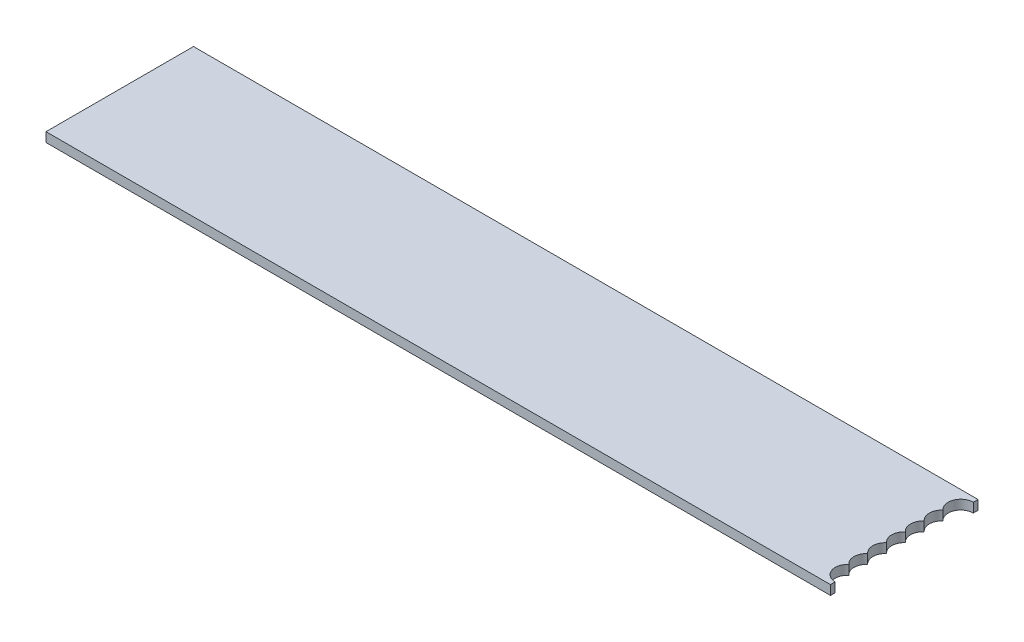
ISO-10303-21;
HEADER;
FILE_DESCRIPTION(('STEP AP214'),'2;1');
FILE_NAME('part.step','',(''),(''),'','','');
FILE_SCHEMA(('AUTOMOTIVE_DESIGN { 1 0 10303 214 1 1 1 1 }'));
ENDSEC;
DATA;
#1=APPLICATION_CONTEXT('core data for automotive mechanical design processes');
#2=APPLICATION_PROTOCOL_DEFINITION('international standard','automotive_design',2000,#1);
#3=PRODUCT_CONTEXT('',#1,'mechanical');
#4=PRODUCT('Part','Part','',(#3));
#5=PRODUCT_RELATED_PRODUCT_CATEGORY('part','',(#4));
#6=PRODUCT_DEFINITION_FORMATION('','',#4);
#7=PRODUCT_DEFINITION_CONTEXT('part definition',#1,'design');
#8=PRODUCT_DEFINITION('design','',#6,#7);
#9=PRODUCT_DEFINITION_SHAPE('','',#8);
#10=(LENGTH_UNIT() NAMED_UNIT(*) SI_UNIT(.MILLI.,.METRE.));
#11=(NAMED_UNIT(*) PLANE_ANGLE_UNIT() SI_UNIT($,.RADIAN.));
#12=(NAMED_UNIT(*) SI_UNIT($,.STERADIAN.) SOLID_ANGLE_UNIT());
#13=UNCERTAINTY_MEASURE_WITH_UNIT(LENGTH_MEASURE(1.E-05),#10,'distance_accuracy_value','');
#14=(GEOMETRIC_REPRESENTATION_CONTEXT(3) GLOBAL_UNCERTAINTY_ASSIGNED_CONTEXT((#13)) GLOBAL_UNIT_ASSIGNED_CONTEXT((#10,
#11,#12)) REPRESENTATION_CONTEXT('',''));
#15=CARTESIAN_POINT('',(0.,0.,0.));
#16=DIRECTION('',(0.,0.,1.));
#17=DIRECTION('',(1.,0.,0.));
#18=AXIS2_PLACEMENT_3D('',#15,#16,#17);
#19=CARTESIAN_POINT('',(62.5,1.5,11.75));
#20=DIRECTION('',(-1.,0.,0.));
#21=DIRECTION('',(0.,0.,1.));
#22=AXIS2_PLACEMENT_3D('',#19,#20,#21);
#23=PLANE('',#22);
#24=DIRECTION('',(0.,0.,-1.));
#25=VECTOR('',#24,1.);
#26=CARTESIAN_POINT('',(62.5,0.,11.75));
#27=LINE('',#26,#25);
#28=CARTESIAN_POINT('',(62.5,0.,11.75));
#29=VERTEX_POINT('',#28);
#30=CARTESIAN_POINT('',(62.5,0.,11.));
#31=VERTEX_POINT('',#30);
#32=EDGE_CURVE('E167',#29,#31,#27,.T.);
#33=ORIENTED_EDGE('',*,*,#32,.T.);
#34=DIRECTION('',(0.,1.,0.));
#35=VECTOR('',#34,1.);
#36=CARTESIAN_POINT('',(62.5,0.,11.));
#37=LINE('',#36,#35);
#38=CARTESIAN_POINT('',(62.5,1.5,11.));
#39=VERTEX_POINT('',#38);
#40=EDGE_CURVE('E168',#31,#39,#37,.T.);
#41=ORIENTED_EDGE('',*,*,#40,.T.);
#42=DIRECTION('',(0.,0.,-1.));
#43=VECTOR('',#42,1.);
#44=CARTESIAN_POINT('',(62.5,1.5,11.75));
#45=LINE('',#44,#43);
#46=CARTESIAN_POINT('',(62.5,1.5,11.75));
#47=VERTEX_POINT('',#46);
#48=EDGE_CURVE('E205',#47,#39,#45,.T.);
#49=ORIENTED_EDGE('',*,*,#48,.F.);
#50=DIRECTION('',(0.,-1.,0.));
#51=VECTOR('',#50,1.);
#52=CARTESIAN_POINT('',(62.5,1.5,11.75));
#53=LINE('',#52,#51);
#54=EDGE_CURVE('E186',#47,#29,#53,.T.);
#55=ORIENTED_EDGE('',*,*,#54,.T.);
#56=EDGE_LOOP('',(#33,#41,#49,#55));
#57=FACE_BOUND('',#56,.T.);
#58=ADVANCED_FACE('F45',(#57),#23,.F.);
#59=CARTESIAN_POINT('',(62.5,1.5,-11.));
#60=VERTEX_POINT('',#59);
#61=CARTESIAN_POINT('',(62.5,1.5,-11.75));
#62=VERTEX_POINT('',#61);
#63=EDGE_CURVE('E98',#60,#62,#45,.T.);
#64=ORIENTED_EDGE('',*,*,#63,.F.);
#65=DIRECTION('',(0.,1.,0.));
#66=VECTOR('',#65,1.);
#67=CARTESIAN_POINT('',(62.5,0.,-11.));
#68=LINE('',#67,#66);
#69=CARTESIAN_POINT('',(62.5,0.,-11.));
#70=VERTEX_POINT('',#69);
#71=EDGE_CURVE('E148',#70,#60,#68,.T.);
#72=ORIENTED_EDGE('',*,*,#71,.F.);
#73=CARTESIAN_POINT('',(62.5,0.,-11.75));
#74=VERTEX_POINT('',#73);
#75=EDGE_CURVE('E157',#70,#74,#27,.T.);
#76=ORIENTED_EDGE('',*,*,#75,.T.);
#77=DIRECTION('',(0.,-1.,0.));
#78=VECTOR('',#77,1.);
#79=CARTESIAN_POINT('',(62.5,1.5,-11.75));
#80=LINE('',#79,#78);
#81=EDGE_CURVE('E11',#62,#74,#80,.T.);
#82=ORIENTED_EDGE('',*,*,#81,.F.);
#83=EDGE_LOOP('',(#64,#72,#76,#82));
#84=FACE_BOUND('',#83,.T.);
#85=ADVANCED_FACE('F47',(#84),#23,.F.);
#86=CARTESIAN_POINT('',(-62.5,1.5,-11.75));
#87=DIRECTION('',(0.,0.,1.));
#88=DIRECTION('',(1.,0.,0.));
#89=AXIS2_PLACEMENT_3D('',#86,#87,#88);
#90=PLANE('',#89);
#91=DIRECTION('',(-1.,0.,0.));
#92=VECTOR('',#91,1.);
#93=CARTESIAN_POINT('',(-62.5,0.,-11.75));
#94=LINE('',#93,#92);
#95=CARTESIAN_POINT('',(-62.5,0.,-11.75));
#96=VERTEX_POINT('',#95);
#97=EDGE_CURVE('E165',#74,#96,#94,.T.);
#98=ORIENTED_EDGE('',*,*,#97,.T.);
#99=DIRECTION('',(0.,-1.,0.));
#100=VECTOR('',#99,1.);
#101=CARTESIAN_POINT('',(-62.5,1.5,-11.75));
#102=LINE('',#101,#100);
#103=CARTESIAN_POINT('',(-62.5,1.5,-11.75));
#104=VERTEX_POINT('',#103);
#105=EDGE_CURVE('E54',#104,#96,#102,.T.);
#106=ORIENTED_EDGE('',*,*,#105,.F.);
#107=DIRECTION('',(-1.,0.,0.));
#108=VECTOR('',#107,1.);
#109=CARTESIAN_POINT('',(-62.5,1.5,-11.75));
#110=LINE('',#109,#108);
#111=EDGE_CURVE('E209',#62,#104,#110,.T.);
#112=ORIENTED_EDGE('',*,*,#111,.F.);
#113=ORIENTED_EDGE('',*,*,#81,.T.);
#114=EDGE_LOOP('',(#98,#106,#112,#113));
#115=FACE_BOUND('',#114,.T.);
#116=ADVANCED_FACE('F309',(#115),#90,.F.);
#117=CARTESIAN_POINT('',(-62.5,1.5,11.75));
#118=DIRECTION('',(1.,0.,0.));
#119=DIRECTION('',(0.,0.,-1.));
#120=AXIS2_PLACEMENT_3D('',#117,#118,#119);
#121=PLANE('',#120);
#122=DIRECTION('',(0.,0.,1.));
#123=VECTOR('',#122,1.);
#124=CARTESIAN_POINT('',(-62.5,0.,11.75));
#125=LINE('',#124,#123);
#126=CARTESIAN_POINT('',(-62.5,0.,11.75));
#127=VERTEX_POINT('',#126);
#128=EDGE_CURVE('E181',#96,#127,#125,.T.);
#129=ORIENTED_EDGE('',*,*,#128,.T.);
#130=DIRECTION('',(0.,-1.,0.));
#131=VECTOR('',#130,1.);
#132=CARTESIAN_POINT('',(-62.5,1.5,11.75));
#133=LINE('',#132,#131);
#134=CARTESIAN_POINT('',(-62.5,1.5,11.75));
#135=VERTEX_POINT('',#134);
#136=EDGE_CURVE('E189',#135,#127,#133,.T.);
#137=ORIENTED_EDGE('',*,*,#136,.F.);
#138=DIRECTION('',(0.,0.,1.));
#139=VECTOR('',#138,1.);
#140=CARTESIAN_POINT('',(-62.5,1.5,11.75));
#141=LINE('',#140,#139);
#142=EDGE_CURVE('E198',#104,#135,#141,.T.);
#143=ORIENTED_EDGE('',*,*,#142,.F.);
#144=ORIENTED_EDGE('',*,*,#105,.T.);
#145=EDGE_LOOP('',(#129,#137,#143,#144));
#146=FACE_BOUND('',#145,.T.);
#147=ADVANCED_FACE('F196',(#146),#121,.F.);
#148=CARTESIAN_POINT('',(-62.5,1.5,11.75));
#149=DIRECTION('',(0.,0.,-1.));
#150=DIRECTION('',(-1.,0.,0.));
#151=AXIS2_PLACEMENT_3D('',#148,#149,#150);
#152=PLANE('',#151);
#153=DIRECTION('',(1.,0.,0.));
#154=VECTOR('',#153,1.);
#155=CARTESIAN_POINT('',(-62.5,0.,11.75));
#156=LINE('',#155,#154);
#157=EDGE_CURVE('E91',#127,#29,#156,.T.);
#158=ORIENTED_EDGE('',*,*,#157,.T.);
#159=ORIENTED_EDGE('',*,*,#54,.F.);
#160=DIRECTION('',(1.,0.,0.));
#161=VECTOR('',#160,1.);
#162=CARTESIAN_POINT('',(-62.5,1.5,11.75));
#163=LINE('',#162,#161);
#164=EDGE_CURVE('E70',#135,#47,#163,.T.);
#165=ORIENTED_EDGE('',*,*,#164,.F.);
#166=ORIENTED_EDGE('',*,*,#136,.T.);
#167=EDGE_LOOP('',(#158,#159,#165,#166));
#168=FACE_BOUND('',#167,.T.);
#169=ADVANCED_FACE('F206',(#168),#152,.F.);
#170=CARTESIAN_POINT('',(0.,1.5,0.));
#171=DIRECTION('',(0.,-1.,0.));
#172=DIRECTION('',(0.,0.,-1.));
#173=AXIS2_PLACEMENT_3D('',#170,#171,#172);
#174=PLANE('',#173);
#175=ORIENTED_EDGE('',*,*,#48,.T.);
#176=CARTESIAN_POINT('',(62.5000000000001,1.5,9.));
#177=DIRECTION('',(0.,1.,0.));
#178=DIRECTION('',(0.,0.,1.));
#179=AXIS2_PLACEMENT_3D('',#176,#177,#178);
#180=CIRCLE('',#179,2.);
#181=CARTESIAN_POINT('',(61.1771243444678,1.5,7.5));
#182=VERTEX_POINT('',#181);
#183=EDGE_CURVE('E153',#182,#39,#180,.T.);
#184=ORIENTED_EDGE('',*,*,#183,.F.);
#185=CARTESIAN_POINT('',(62.5000000000001,1.5,6.));
#186=DIRECTION('',(0.,1.,0.));
#187=DIRECTION('',(0.,0.,1.));
#188=AXIS2_PLACEMENT_3D('',#185,#186,#187);
#189=CIRCLE('',#188,2.);
#190=CARTESIAN_POINT('',(61.1771243444678,1.5,4.50000000000001));
#191=VERTEX_POINT('',#190);
#192=EDGE_CURVE('E233',#191,#182,#189,.T.);
#193=ORIENTED_EDGE('',*,*,#192,.F.);
#194=CARTESIAN_POINT('',(62.5000000000001,1.5,3.));
#195=DIRECTION('',(0.,1.,0.));
#196=DIRECTION('',(0.,0.,1.));
#197=AXIS2_PLACEMENT_3D('',#194,#195,#196);
#198=CIRCLE('',#197,2.);
#199=CARTESIAN_POINT('',(61.1771243444678,1.5,1.50000000000003));
#200=VERTEX_POINT('',#199);
#201=EDGE_CURVE('E237',#200,#191,#198,.T.);
#202=ORIENTED_EDGE('',*,*,#201,.F.);
#203=CARTESIAN_POINT('',(62.5,1.5,0.));
#204=DIRECTION('',(0.,1.,0.));
#205=DIRECTION('',(0.,0.,1.));
#206=AXIS2_PLACEMENT_3D('',#203,#204,#205);
#207=CIRCLE('',#206,2.);
#208=CARTESIAN_POINT('',(61.1771243444677,1.5,-1.5));
#209=VERTEX_POINT('',#208);
#210=EDGE_CURVE('E241',#209,#200,#207,.T.);
#211=ORIENTED_EDGE('',*,*,#210,.F.);
#212=CARTESIAN_POINT('',(62.5,1.5,-3.));
#213=DIRECTION('',(0.,1.,0.));
#214=DIRECTION('',(0.,0.,1.));
#215=AXIS2_PLACEMENT_3D('',#212,#213,#214);
#216=CIRCLE('',#215,2.);
#217=CARTESIAN_POINT('',(61.1771243444677,1.5,-4.5));
#218=VERTEX_POINT('',#217);
#219=EDGE_CURVE('E245',#218,#209,#216,.T.);
#220=ORIENTED_EDGE('',*,*,#219,.F.);
#221=CARTESIAN_POINT('',(62.5,1.5,-6.));
#222=DIRECTION('',(0.,1.,0.));
#223=DIRECTION('',(0.,0.,1.));
#224=AXIS2_PLACEMENT_3D('',#221,#222,#223);
#225=CIRCLE('',#224,2.);
#226=CARTESIAN_POINT('',(61.1771243444677,1.5,-7.5));
#227=VERTEX_POINT('',#226);
#228=EDGE_CURVE('E249',#227,#218,#225,.T.);
#229=ORIENTED_EDGE('',*,*,#228,.F.);
#230=CARTESIAN_POINT('',(62.5,1.5,-9.));
#231=DIRECTION('',(0.,1.,0.));
#232=DIRECTION('',(0.,0.,1.));
#233=AXIS2_PLACEMENT_3D('',#230,#231,#232);
#234=CIRCLE('',#233,2.);
#235=EDGE_CURVE('E253',#60,#227,#234,.T.);
#236=ORIENTED_EDGE('',*,*,#235,.F.);
#237=ORIENTED_EDGE('',*,*,#63,.T.);
#238=ORIENTED_EDGE('',*,*,#111,.T.);
#239=ORIENTED_EDGE('',*,*,#142,.T.);
#240=ORIENTED_EDGE('',*,*,#164,.T.);
#241=EDGE_LOOP('',(#175,#184,#193,#202,#211,#220,#229,#236,#237,#238,#239,#240));
#242=FACE_BOUND('',#241,.T.);
#243=ADVANCED_FACE('F293',(#242),#174,.F.);
#244=CARTESIAN_POINT('',(0.,0.,0.));
#245=DIRECTION('',(0.,-1.,0.));
#246=DIRECTION('',(0.,0.,-1.));
#247=AXIS2_PLACEMENT_3D('',#244,#245,#246);
#248=PLANE('',#247);
#249=CARTESIAN_POINT('',(62.5000000000001,0.,9.));
#250=DIRECTION('',(0.,1.,0.));
#251=DIRECTION('',(0.,0.,1.));
#252=AXIS2_PLACEMENT_3D('',#249,#250,#251);
#253=CIRCLE('',#252,2.);
#254=CARTESIAN_POINT('',(61.1771243444678,0.,7.5));
#255=VERTEX_POINT('',#254);
#256=EDGE_CURVE('E160',#255,#31,#253,.T.);
#257=ORIENTED_EDGE('',*,*,#256,.T.);
#258=ORIENTED_EDGE('',*,*,#32,.F.);
#259=ORIENTED_EDGE('',*,*,#157,.F.);
#260=ORIENTED_EDGE('',*,*,#128,.F.);
#261=ORIENTED_EDGE('',*,*,#97,.F.);
#262=ORIENTED_EDGE('',*,*,#75,.F.);
#263=CARTESIAN_POINT('',(62.5,0.,-9.));
#264=DIRECTION('',(0.,1.,0.));
#265=DIRECTION('',(0.,0.,1.));
#266=AXIS2_PLACEMENT_3D('',#263,#264,#265);
#267=CIRCLE('',#266,2.);
#268=CARTESIAN_POINT('',(61.1771243444677,0.,-7.5));
#269=VERTEX_POINT('',#268);
#270=EDGE_CURVE('E144',#70,#269,#267,.T.);
#271=ORIENTED_EDGE('',*,*,#270,.T.);
#272=CARTESIAN_POINT('',(62.5,0.,-6.));
#273=DIRECTION('',(0.,1.,0.));
#274=DIRECTION('',(0.,0.,1.));
#275=AXIS2_PLACEMENT_3D('',#272,#273,#274);
#276=CIRCLE('',#275,2.);
#277=CARTESIAN_POINT('',(61.1771243444677,0.,-4.5));
#278=VERTEX_POINT('',#277);
#279=EDGE_CURVE('E61',#269,#278,#276,.T.);
#280=ORIENTED_EDGE('',*,*,#279,.T.);
#281=CARTESIAN_POINT('',(62.5,0.,-3.));
#282=DIRECTION('',(0.,1.,0.));
#283=DIRECTION('',(0.,0.,1.));
#284=AXIS2_PLACEMENT_3D('',#281,#282,#283);
#285=CIRCLE('',#284,2.);
#286=CARTESIAN_POINT('',(61.1771243444677,0.,-1.5));
#287=VERTEX_POINT('',#286);
#288=EDGE_CURVE('E269',#278,#287,#285,.T.);
#289=ORIENTED_EDGE('',*,*,#288,.T.);
#290=CARTESIAN_POINT('',(62.5,0.,0.));
#291=DIRECTION('',(0.,1.,0.));
#292=DIRECTION('',(0.,0.,1.));
#293=AXIS2_PLACEMENT_3D('',#290,#291,#292);
#294=CIRCLE('',#293,2.);
#295=CARTESIAN_POINT('',(61.1771243444678,0.,1.50000000000003));
#296=VERTEX_POINT('',#295);
#297=EDGE_CURVE('E265',#287,#296,#294,.T.);
#298=ORIENTED_EDGE('',*,*,#297,.T.);
#299=CARTESIAN_POINT('',(62.5000000000001,0.,3.));
#300=DIRECTION('',(0.,1.,0.));
#301=DIRECTION('',(0.,0.,1.));
#302=AXIS2_PLACEMENT_3D('',#299,#300,#301);
#303=CIRCLE('',#302,2.);
#304=CARTESIAN_POINT('',(61.1771243444678,0.,4.50000000000001));
#305=VERTEX_POINT('',#304);
#306=EDGE_CURVE('E261',#296,#305,#303,.T.);
#307=ORIENTED_EDGE('',*,*,#306,.T.);
#308=CARTESIAN_POINT('',(62.5000000000001,0.,6.));
#309=DIRECTION('',(0.,1.,0.));
#310=DIRECTION('',(0.,0.,1.));
#311=AXIS2_PLACEMENT_3D('',#308,#309,#310);
#312=CIRCLE('',#311,2.);
#313=EDGE_CURVE('E258',#305,#255,#312,.T.);
#314=ORIENTED_EDGE('',*,*,#313,.T.);
#315=EDGE_LOOP('',(#257,#258,#259,#260,#261,#262,#271,#280,#289,#298,#307,#314));
#316=FACE_BOUND('',#315,.T.);
#317=ADVANCED_FACE('F163',(#316),#248,.T.);
#318=CARTESIAN_POINT('',(62.5000000000001,0.,9.));
#319=DIRECTION('',(0.,1.,0.));
#320=DIRECTION('',(0.,0.,1.));
#321=AXIS2_PLACEMENT_3D('',#318,#319,#320);
#322=CYLINDRICAL_SURFACE('',#321,2.);
#323=ORIENTED_EDGE('',*,*,#183,.T.);
#324=ORIENTED_EDGE('',*,*,#40,.F.);
#325=ORIENTED_EDGE('',*,*,#256,.F.);
#326=DIRECTION('',(0.,1.,0.));
#327=VECTOR('',#326,1.);
#328=CARTESIAN_POINT('',(61.1771243444678,0.,7.5));
#329=LINE('',#328,#327);
#330=EDGE_CURVE('E174',#255,#182,#329,.T.);
#331=ORIENTED_EDGE('',*,*,#330,.T.);
#332=EDGE_LOOP('',(#323,#324,#325,#331));
#333=FACE_BOUND('',#332,.T.);
#334=ADVANCED_FACE('F292',(#333),#322,.F.);
#335=CARTESIAN_POINT('',(62.5000000000001,0.,6.));
#336=DIRECTION('',(0.,1.,0.));
#337=DIRECTION('',(0.,0.,1.));
#338=AXIS2_PLACEMENT_3D('',#335,#336,#337);
#339=CYLINDRICAL_SURFACE('',#338,2.);
#340=ORIENTED_EDGE('',*,*,#192,.T.);
#341=ORIENTED_EDGE('',*,*,#330,.F.);
#342=ORIENTED_EDGE('',*,*,#313,.F.);
#343=DIRECTION('',(0.,1.,0.));
#344=VECTOR('',#343,1.);
#345=CARTESIAN_POINT('',(61.1771243444678,0.,4.50000000000001));
#346=LINE('',#345,#344);
#347=EDGE_CURVE('E226',#305,#191,#346,.T.);
#348=ORIENTED_EDGE('',*,*,#347,.T.);
#349=EDGE_LOOP('',(#340,#341,#342,#348));
#350=FACE_BOUND('',#349,.T.);
#351=ADVANCED_FACE('F288',(#350),#339,.F.);
#352=CARTESIAN_POINT('',(62.5000000000001,0.,3.));
#353=DIRECTION('',(0.,1.,0.));
#354=DIRECTION('',(0.,0.,1.));
#355=AXIS2_PLACEMENT_3D('',#352,#353,#354);
#356=CYLINDRICAL_SURFACE('',#355,2.);
#357=ORIENTED_EDGE('',*,*,#201,.T.);
#358=ORIENTED_EDGE('',*,*,#347,.F.);
#359=ORIENTED_EDGE('',*,*,#306,.F.);
#360=DIRECTION('',(0.,1.,0.));
#361=VECTOR('',#360,1.);
#362=CARTESIAN_POINT('',(61.1771243444678,0.,1.50000000000003));
#363=LINE('',#362,#361);
#364=EDGE_CURVE('E223',#296,#200,#363,.T.);
#365=ORIENTED_EDGE('',*,*,#364,.T.);
#366=EDGE_LOOP('',(#357,#358,#359,#365));
#367=FACE_BOUND('',#366,.T.);
#368=ADVANCED_FACE('F285',(#367),#356,.F.);
#369=CARTESIAN_POINT('',(62.5,0.,0.));
#370=DIRECTION('',(0.,1.,0.));
#371=DIRECTION('',(0.,0.,1.));
#372=AXIS2_PLACEMENT_3D('',#369,#370,#371);
#373=CYLINDRICAL_SURFACE('',#372,2.);
#374=ORIENTED_EDGE('',*,*,#210,.T.);
#375=ORIENTED_EDGE('',*,*,#364,.F.);
#376=ORIENTED_EDGE('',*,*,#297,.F.);
#377=DIRECTION('',(0.,1.,0.));
#378=VECTOR('',#377,1.);
#379=CARTESIAN_POINT('',(61.1771243444677,0.,-1.5));
#380=LINE('',#379,#378);
#381=EDGE_CURVE('E220',#287,#209,#380,.T.);
#382=ORIENTED_EDGE('',*,*,#381,.T.);
#383=EDGE_LOOP('',(#374,#375,#376,#382));
#384=FACE_BOUND('',#383,.T.);
#385=ADVANCED_FACE('F281',(#384),#373,.F.);
#386=CARTESIAN_POINT('',(62.5,0.,-3.));
#387=DIRECTION('',(0.,1.,0.));
#388=DIRECTION('',(0.,0.,1.));
#389=AXIS2_PLACEMENT_3D('',#386,#387,#388);
#390=CYLINDRICAL_SURFACE('',#389,2.);
#391=ORIENTED_EDGE('',*,*,#219,.T.);
#392=ORIENTED_EDGE('',*,*,#381,.F.);
#393=ORIENTED_EDGE('',*,*,#288,.F.);
#394=DIRECTION('',(0.,1.,0.));
#395=VECTOR('',#394,1.);
#396=CARTESIAN_POINT('',(61.1771243444677,0.,-4.5));
#397=LINE('',#396,#395);
#398=EDGE_CURVE('E217',#278,#218,#397,.T.);
#399=ORIENTED_EDGE('',*,*,#398,.T.);
#400=EDGE_LOOP('',(#391,#392,#393,#399));
#401=FACE_BOUND('',#400,.T.);
#402=ADVANCED_FACE('F277',(#401),#390,.F.);
#403=CARTESIAN_POINT('',(62.5,0.,-6.));
#404=DIRECTION('',(0.,1.,0.));
#405=DIRECTION('',(0.,0.,1.));
#406=AXIS2_PLACEMENT_3D('',#403,#404,#405);
#407=CYLINDRICAL_SURFACE('',#406,2.);
#408=ORIENTED_EDGE('',*,*,#228,.T.);
#409=ORIENTED_EDGE('',*,*,#398,.F.);
#410=ORIENTED_EDGE('',*,*,#279,.F.);
#411=DIRECTION('',(0.,1.,0.));
#412=VECTOR('',#411,1.);
#413=CARTESIAN_POINT('',(61.1771243444677,0.,-7.5));
#414=LINE('',#413,#412);
#415=EDGE_CURVE('E149',#269,#227,#414,.T.);
#416=ORIENTED_EDGE('',*,*,#415,.T.);
#417=EDGE_LOOP('',(#408,#409,#410,#416));
#418=FACE_BOUND('',#417,.T.);
#419=ADVANCED_FACE('F295',(#418),#407,.F.);
#420=CARTESIAN_POINT('',(62.5,0.,-9.));
#421=DIRECTION('',(0.,1.,0.));
#422=DIRECTION('',(0.,0.,1.));
#423=AXIS2_PLACEMENT_3D('',#420,#421,#422);
#424=CYLINDRICAL_SURFACE('',#423,2.);
#425=ORIENTED_EDGE('',*,*,#235,.T.);
#426=ORIENTED_EDGE('',*,*,#415,.F.);
#427=ORIENTED_EDGE('',*,*,#270,.F.);
#428=ORIENTED_EDGE('',*,*,#71,.T.);
#429=EDGE_LOOP('',(#425,#426,#427,#428));
#430=FACE_BOUND('',#429,.T.);
#431=ADVANCED_FACE('F147',(#430),#424,.F.);
#432=CLOSED_SHELL('',(#58,#85,#116,#147,#169,#243,#317,#334,#351,#368,#385,#402,#419,#431));
#433=MANIFOLD_SOLID_BREP('B2',#432);
#434=ADVANCED_BREP_SHAPE_REPRESENTATION('',(#18,#433),#14);
#435=SHAPE_DEFINITION_REPRESENTATION(#9,#434);
ENDSEC;
END-ISO-10303-21;
